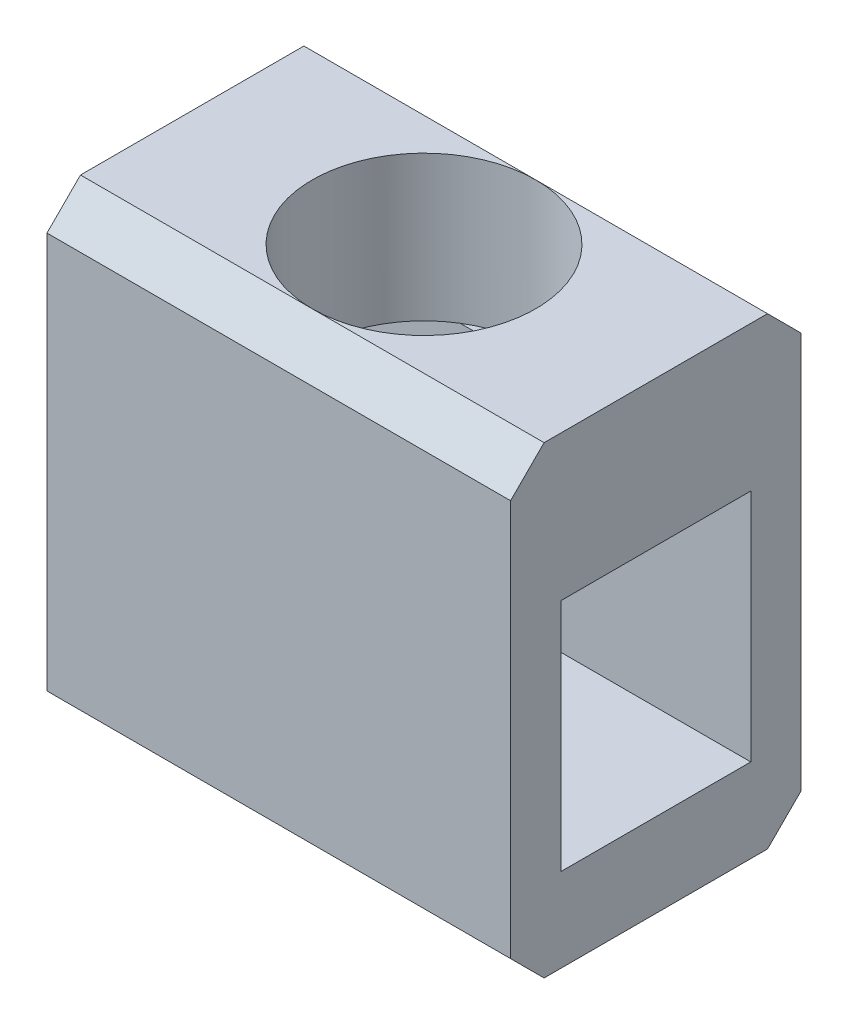
ISO-10303-21;
HEADER;
FILE_DESCRIPTION(('STEP AP214'),'2;1');
FILE_NAME('part.step','',(''),(''),'','','');
FILE_SCHEMA(('AUTOMOTIVE_DESIGN { 1 0 10303 214 1 1 1 1 }'));
ENDSEC;
DATA;
#1=APPLICATION_CONTEXT('core data for automotive mechanical design processes');
#2=APPLICATION_PROTOCOL_DEFINITION('international standard','automotive_design',2000,#1);
#3=PRODUCT_CONTEXT('',#1,'mechanical');
#4=PRODUCT('Part','Part','',(#3));
#5=PRODUCT_RELATED_PRODUCT_CATEGORY('part','',(#4));
#6=PRODUCT_DEFINITION_FORMATION('','',#4);
#7=PRODUCT_DEFINITION_CONTEXT('part definition',#1,'design');
#8=PRODUCT_DEFINITION('design','',#6,#7);
#9=PRODUCT_DEFINITION_SHAPE('','',#8);
#10=(LENGTH_UNIT() NAMED_UNIT(*) SI_UNIT(.MILLI.,.METRE.));
#11=(NAMED_UNIT(*) PLANE_ANGLE_UNIT() SI_UNIT($,.RADIAN.));
#12=(NAMED_UNIT(*) SI_UNIT($,.STERADIAN.) SOLID_ANGLE_UNIT());
#13=UNCERTAINTY_MEASURE_WITH_UNIT(LENGTH_MEASURE(1.E-05),#10,'distance_accuracy_value','');
#14=(GEOMETRIC_REPRESENTATION_CONTEXT(3) GLOBAL_UNCERTAINTY_ASSIGNED_CONTEXT((#13)) GLOBAL_UNIT_ASSIGNED_CONTEXT((#10,
#11,#12)) REPRESENTATION_CONTEXT('',''));
#15=CARTESIAN_POINT('',(0.,0.,0.));
#16=DIRECTION('',(0.,0.,1.));
#17=DIRECTION('',(1.,0.,0.));
#18=AXIS2_PLACEMENT_3D('',#15,#16,#17);
#19=CARTESIAN_POINT('',(12.992925392834,34.418991117245,-1.734184018515));
#20=DIRECTION('',(0.,-1.,0.));
#21=DIRECTION('',(0.,0.,-1.));
#22=AXIS2_PLACEMENT_3D('',#19,#20,#21);
#23=PLANE('',#22);
#24=DIRECTION('',(0.,0.,-1.));
#25=VECTOR('',#24,1.);
#26=CARTESIAN_POINT('',(10.917925392833,34.418991117245,-1.734184018515));
#27=LINE('',#26,#25);
#28=CARTESIAN_POINT('',(10.917925392833,34.418991117245,-0.03418401851468));
#29=VERTEX_POINT('',#28);
#30=CARTESIAN_POINT('',(10.917925392833,34.418991117245,-1.734184018515));
#31=VERTEX_POINT('',#30);
#32=EDGE_CURVE('E202',#29,#31,#27,.T.);
#33=ORIENTED_EDGE('',*,*,#32,.T.);
#34=DIRECTION('',(1.,0.,0.));
#35=VECTOR('',#34,1.);
#36=CARTESIAN_POINT('',(12.992925392834,34.418991117245,-1.734184018515));
#37=LINE('',#36,#35);
#38=CARTESIAN_POINT('',(12.4661427051912,34.418991117245,-1.734184018515));
#39=VERTEX_POINT('',#38);
#40=EDGE_CURVE('E199',#31,#39,#37,.T.);
#41=ORIENTED_EDGE('',*,*,#40,.T.);
#42=CARTESIAN_POINT('',(12.992925392834,34.418991117245,-0.884184018515));
#43=DIRECTION('',(0.,1.,0.));
#44=DIRECTION('',(0.,0.,1.));
#45=AXIS2_PLACEMENT_3D('',#42,#43,#44);
#46=CIRCLE('',#45,1.);
#47=CARTESIAN_POINT('',(12.4661427051914,34.418991117245,-0.03418401851468));
#48=VERTEX_POINT('',#47);
#49=EDGE_CURVE('E133',#39,#48,#46,.T.);
#50=ORIENTED_EDGE('',*,*,#49,.T.);
#51=DIRECTION('',(1.,0.,0.));
#52=VECTOR('',#51,1.);
#53=CARTESIAN_POINT('',(12.992925392834,34.418991117245,-0.0341840185146801));
#54=LINE('',#53,#52);
#55=EDGE_CURVE('E154',#48,#29,#54,.F.);
#56=ORIENTED_EDGE('',*,*,#55,.T.);
#57=EDGE_LOOP('',(#33,#41,#50,#56));
#58=FACE_BOUND('',#57,.T.);
#59=ADVANCED_FACE('F17',(#58),#23,.T.);
#60=CARTESIAN_POINT('',(12.992925392834,34.418991117245,-1.734184018515));
#61=DIRECTION('',(0.,-1.,0.));
#62=DIRECTION('',(0.,0.,-1.));
#63=AXIS2_PLACEMENT_3D('',#60,#61,#62);
#64=PLANE('',#63);
#65=DIRECTION('',(-1.,0.,0.));
#66=VECTOR('',#65,1.);
#67=CARTESIAN_POINT('',(12.992925392834,34.418991117245,-0.03418401851468));
#68=LINE('',#67,#66);
#69=CARTESIAN_POINT('',(13.5197080804761,34.418991117245,-0.03418401851468));
#70=VERTEX_POINT('',#69);
#71=EDGE_CURVE('E131',#48,#70,#68,.F.);
#72=ORIENTED_EDGE('',*,*,#71,.F.);
#73=CARTESIAN_POINT('',(12.992925392834,34.418991117245,-0.884184018515));
#74=DIRECTION('',(0.,1.,0.));
#75=DIRECTION('',(0.,0.,1.));
#76=AXIS2_PLACEMENT_3D('',#73,#74,#75);
#77=CIRCLE('',#76,1.);
#78=EDGE_CURVE('E128',#48,#70,#77,.T.);
#79=ORIENTED_EDGE('',*,*,#78,.T.);
#80=EDGE_LOOP('',(#72,#79));
#81=FACE_BOUND('',#80,.T.);
#82=ADVANCED_FACE('F129',(#81),#64,.F.);
#83=CARTESIAN_POINT('',(12.992925392834,34.418991117245,-1.734184018515));
#84=DIRECTION('',(0.,-1.,0.));
#85=DIRECTION('',(0.,0.,-1.));
#86=AXIS2_PLACEMENT_3D('',#83,#84,#85);
#87=PLANE('',#86);
#88=DIRECTION('',(1.,0.,0.));
#89=VECTOR('',#88,1.);
#90=CARTESIAN_POINT('',(12.992925392834,34.418991117245,-1.734184018515));
#91=LINE('',#90,#89);
#92=CARTESIAN_POINT('',(13.5197080804763,34.418991117245,-1.734184018515));
#93=VERTEX_POINT('',#92);
#94=EDGE_CURVE('E249',#93,#39,#91,.F.);
#95=ORIENTED_EDGE('',*,*,#94,.F.);
#96=CARTESIAN_POINT('',(12.992925392834,34.418991117245,-0.884184018515));
#97=DIRECTION('',(0.,1.,0.));
#98=DIRECTION('',(0.,0.,1.));
#99=AXIS2_PLACEMENT_3D('',#96,#97,#98);
#100=CIRCLE('',#99,1.);
#101=EDGE_CURVE('E122',#93,#39,#100,.T.);
#102=ORIENTED_EDGE('',*,*,#101,.T.);
#103=EDGE_LOOP('',(#95,#102));
#104=FACE_BOUND('',#103,.T.);
#105=ADVANCED_FACE('F487',(#104),#87,.F.);
#106=CARTESIAN_POINT('',(12.992925392834,32.318991117245,-0.03418401851468));
#107=DIRECTION('',(0.,1.,0.));
#108=DIRECTION('',(0.,0.,1.));
#109=AXIS2_PLACEMENT_3D('',#106,#107,#108);
#110=PLANE('',#109);
#111=DIRECTION('',(-1.,0.,0.));
#112=VECTOR('',#111,1.);
#113=CARTESIAN_POINT('',(12.992925392834,32.318991117245,-0.03418401851468));
#114=LINE('',#113,#112);
#115=CARTESIAN_POINT('',(15.067925392834,32.318991117245,-0.03418401851468));
#116=VERTEX_POINT('',#115);
#117=CARTESIAN_POINT('',(10.917925392833,32.318991117245,-0.03418401851468));
#118=VERTEX_POINT('',#117);
#119=EDGE_CURVE('E149',#116,#118,#114,.T.);
#120=ORIENTED_EDGE('',*,*,#119,.F.);
#121=DIRECTION('',(0.,0.,1.));
#122=VECTOR('',#121,1.);
#123=CARTESIAN_POINT('',(15.067925392834,32.318991117245,-0.03418401851468));
#124=LINE('',#123,#122);
#125=CARTESIAN_POINT('',(15.067925392834,32.318991117245,-1.734184018515));
#126=VERTEX_POINT('',#125);
#127=EDGE_CURVE('E142',#116,#126,#124,.F.);
#128=ORIENTED_EDGE('',*,*,#127,.T.);
#129=DIRECTION('',(1.,0.,0.));
#130=VECTOR('',#129,1.);
#131=CARTESIAN_POINT('',(12.992925392834,32.318991117245,-1.734184018515));
#132=LINE('',#131,#130);
#133=CARTESIAN_POINT('',(10.917925392833,32.318991117245,-1.734184018515));
#134=VERTEX_POINT('',#133);
#135=EDGE_CURVE('E245',#134,#126,#132,.T.);
#136=ORIENTED_EDGE('',*,*,#135,.F.);
#137=DIRECTION('',(0.,0.,1.));
#138=VECTOR('',#137,1.);
#139=CARTESIAN_POINT('',(10.917925392833,32.318991117245,-0.03418401851468));
#140=LINE('',#139,#138);
#141=EDGE_CURVE('E162',#134,#118,#140,.T.);
#142=ORIENTED_EDGE('',*,*,#141,.T.);
#143=EDGE_LOOP('',(#120,#128,#136,#142));
#144=FACE_BOUND('',#143,.T.);
#145=ADVANCED_FACE('F244',(#144),#110,.T.);
#146=CARTESIAN_POINT('',(12.992925392834,34.418991117245,-1.734184018515));
#147=DIRECTION('',(0.,-1.,0.));
#148=DIRECTION('',(0.,0.,-1.));
#149=AXIS2_PLACEMENT_3D('',#146,#147,#148);
#150=PLANE('',#149);
#151=DIRECTION('',(0.,0.,-1.));
#152=VECTOR('',#151,1.);
#153=CARTESIAN_POINT('',(15.067925392834,34.418991117245,-1.734184018515));
#154=LINE('',#153,#152);
#155=CARTESIAN_POINT('',(15.067925392834,34.418991117245,-1.734184018515));
#156=VERTEX_POINT('',#155);
#157=CARTESIAN_POINT('',(15.067925392834,34.418991117245,-0.03418401851468));
#158=VERTEX_POINT('',#157);
#159=EDGE_CURVE('E141',#156,#158,#154,.F.);
#160=ORIENTED_EDGE('',*,*,#159,.T.);
#161=DIRECTION('',(-1.,0.,0.));
#162=VECTOR('',#161,1.);
#163=CARTESIAN_POINT('',(12.992925392834,34.418991117245,-0.03418401851468));
#164=LINE('',#163,#162);
#165=EDGE_CURVE('E144',#70,#158,#164,.F.);
#166=ORIENTED_EDGE('',*,*,#165,.F.);
#167=CARTESIAN_POINT('',(12.992925392834,34.418991117245,-0.884184018515));
#168=DIRECTION('',(0.,1.,0.));
#169=DIRECTION('',(0.,0.,1.));
#170=AXIS2_PLACEMENT_3D('',#167,#168,#169);
#171=CIRCLE('',#170,1.);
#172=EDGE_CURVE('E20',#70,#93,#171,.T.);
#173=ORIENTED_EDGE('',*,*,#172,.T.);
#174=DIRECTION('',(1.,0.,0.));
#175=VECTOR('',#174,1.);
#176=CARTESIAN_POINT('',(12.992925392834,34.418991117245,-1.734184018515));
#177=LINE('',#176,#175);
#178=EDGE_CURVE('E225',#156,#93,#177,.F.);
#179=ORIENTED_EDGE('',*,*,#178,.F.);
#180=EDGE_LOOP('',(#160,#166,#173,#179));
#181=FACE_BOUND('',#180,.T.);
#182=ADVANCED_FACE('F145',(#181),#150,.T.);
#183=CARTESIAN_POINT('',(12.992925392834,34.466448576029,-0.884184018515));
#184=DIRECTION('',(0.,1.,0.));
#185=DIRECTION('',(0.,0.,1.));
#186=AXIS2_PLACEMENT_3D('',#183,#184,#185);
#187=CYLINDRICAL_SURFACE('',#186,1.);
#188=CARTESIAN_POINT('',(12.992925392834,35.718991117245,-0.884184018515));
#189=DIRECTION('',(0.,1.,0.));
#190=DIRECTION('',(0.,0.,1.));
#191=AXIS2_PLACEMENT_3D('',#188,#189,#190);
#192=CIRCLE('',#191,1.);
#193=CARTESIAN_POINT('',(12.992925392834,35.718991117245,0.115815981485));
#194=VERTEX_POINT('',#193);
#195=CARTESIAN_POINT('',(12.992925392834,35.718991117245,-1.884184018515));
#196=VERTEX_POINT('',#195);
#197=EDGE_CURVE('E223',#194,#196,#192,.F.);
#198=ORIENTED_EDGE('',*,*,#197,.F.);
#199=CARTESIAN_POINT('',(12.992925392834,35.718991117245,-0.884184018515));
#200=DIRECTION('',(0.,1.,0.));
#201=DIRECTION('',(0.,0.,1.));
#202=AXIS2_PLACEMENT_3D('',#199,#200,#201);
#203=CIRCLE('',#202,1.);
#204=EDGE_CURVE('E156',#196,#194,#203,.F.);
#205=ORIENTED_EDGE('',*,*,#204,.F.);
#206=EDGE_LOOP('',(#198,#205));
#207=FACE_BOUND('',#206,.T.);
#208=ORIENTED_EDGE('',*,*,#172,.F.);
#209=ORIENTED_EDGE('',*,*,#78,.F.);
#210=ORIENTED_EDGE('',*,*,#49,.F.);
#211=ORIENTED_EDGE('',*,*,#101,.F.);
#212=EDGE_LOOP('',(#208,#209,#210,#211));
#213=FACE_BOUND('',#212,.T.);
#214=ADVANCED_FACE('F137',(#207,#213),#187,.F.);
#215=CARTESIAN_POINT('',(12.992925392834,35.568991117245,0.265815981485));
#216=DIRECTION('',(0.,0.707106781186548,0.707106781186548));
#217=DIRECTION('',(0.,-0.707106781186548,0.707106781186548));
#218=AXIS2_PLACEMENT_3D('',#215,#216,#217);
#219=PLANE('',#218);
#220=DIRECTION('',(1.,0.,0.));
#221=VECTOR('',#220,1.);
#222=CARTESIAN_POINT('',(12.992925392834,35.418991117245,0.415815981485));
#223=LINE('',#222,#221);
#224=CARTESIAN_POINT('',(15.067925392834,35.418991117245,0.415815981484998));
#225=VERTEX_POINT('',#224);
#226=CARTESIAN_POINT('',(10.917925392833,35.418991117245,0.415815981484999));
#227=VERTEX_POINT('',#226);
#228=EDGE_CURVE('E178',#225,#227,#223,.F.);
#229=ORIENTED_EDGE('',*,*,#228,.F.);
#230=DIRECTION('',(0.,-0.707106781186548,0.707106781186548));
#231=VECTOR('',#230,1.);
#232=CARTESIAN_POINT('',(15.067925392834,35.568991117245,0.265815981485));
#233=LINE('',#232,#231);
#234=CARTESIAN_POINT('',(15.067925392834,35.718991117245,0.115815981485));
#235=VERTEX_POINT('',#234);
#236=EDGE_CURVE('E173',#225,#235,#233,.F.);
#237=ORIENTED_EDGE('',*,*,#236,.T.);
#238=DIRECTION('',(1.,0.,0.));
#239=VECTOR('',#238,1.);
#240=CARTESIAN_POINT('',(12.992925392834,35.718991117245,0.115815981485));
#241=LINE('',#240,#239);
#242=EDGE_CURVE('E159',#194,#235,#241,.T.);
#243=ORIENTED_EDGE('',*,*,#242,.F.);
#244=DIRECTION('',(1.,0.,0.));
#245=VECTOR('',#244,1.);
#246=CARTESIAN_POINT('',(12.992925392834,35.718991117245,0.115815981485));
#247=LINE('',#246,#245);
#248=CARTESIAN_POINT('',(10.917925392833,35.718991117245,0.115815981485));
#249=VERTEX_POINT('',#248);
#250=EDGE_CURVE('E182',#249,#194,#247,.T.);
#251=ORIENTED_EDGE('',*,*,#250,.F.);
#252=DIRECTION('',(0.,-0.707106781186548,0.707106781186548));
#253=VECTOR('',#252,1.);
#254=CARTESIAN_POINT('',(10.917925392833,35.568991117245,0.265815981485));
#255=LINE('',#254,#253);
#256=EDGE_CURVE('E132',#249,#227,#255,.T.);
#257=ORIENTED_EDGE('',*,*,#256,.T.);
#258=EDGE_LOOP('',(#229,#237,#243,#251,#257));
#259=FACE_BOUND('',#258,.T.);
#260=ADVANCED_FACE('F344',(#259),#219,.T.);
#261=CARTESIAN_POINT('',(12.992925392834,31.718991117245,0.265815981485));
#262=DIRECTION('',(0.,-0.707106781186548,0.707106781186548));
#263=DIRECTION('',(0.,-0.707106781186548,-0.707106781186548));
#264=AXIS2_PLACEMENT_3D('',#261,#262,#263);
#265=PLANE('',#264);
#266=DIRECTION('',(1.,0.,0.));
#267=VECTOR('',#266,1.);
#268=CARTESIAN_POINT('',(12.992925392834,31.868991117245,0.415815981485));
#269=LINE('',#268,#267);
#270=CARTESIAN_POINT('',(10.917925392833,31.868991117245,0.415815981484999));
#271=VERTEX_POINT('',#270);
#272=CARTESIAN_POINT('',(15.067925392834,31.868991117245,0.415815981484999));
#273=VERTEX_POINT('',#272);
#274=EDGE_CURVE('E181',#271,#273,#269,.T.);
#275=ORIENTED_EDGE('',*,*,#274,.F.);
#276=DIRECTION('',(0.,-0.707106781186548,-0.707106781186548));
#277=VECTOR('',#276,1.);
#278=CARTESIAN_POINT('',(10.917925392833,31.718991117245,0.265815981485));
#279=LINE('',#278,#277);
#280=CARTESIAN_POINT('',(10.917925392833,31.568991117245,0.115815981485001));
#281=VERTEX_POINT('',#280);
#282=EDGE_CURVE('E263',#271,#281,#279,.T.);
#283=ORIENTED_EDGE('',*,*,#282,.T.);
#284=DIRECTION('',(1.,0.,0.));
#285=VECTOR('',#284,1.);
#286=CARTESIAN_POINT('',(12.992925392834,31.568991117245,0.115815981485));
#287=LINE('',#286,#285);
#288=CARTESIAN_POINT('',(15.067925392834,31.568991117245,0.115815981485001));
#289=VERTEX_POINT('',#288);
#290=EDGE_CURVE('E292',#289,#281,#287,.F.);
#291=ORIENTED_EDGE('',*,*,#290,.F.);
#292=DIRECTION('',(0.,-0.707106781186548,-0.707106781186548));
#293=VECTOR('',#292,1.);
#294=CARTESIAN_POINT('',(15.067925392834,31.718991117245,0.265815981485));
#295=LINE('',#294,#293);
#296=EDGE_CURVE('E175',#289,#273,#295,.F.);
#297=ORIENTED_EDGE('',*,*,#296,.T.);
#298=EDGE_LOOP('',(#275,#283,#291,#297));
#299=FACE_BOUND('',#298,.T.);
#300=ADVANCED_FACE('F356',(#299),#265,.T.);
#301=CARTESIAN_POINT('',(12.992925392834,35.718991117245,-2.184184018515));
#302=DIRECTION('',(0.,1.,0.));
#303=DIRECTION('',(0.,0.,1.));
#304=AXIS2_PLACEMENT_3D('',#301,#302,#303);
#305=PLANE('',#304);
#306=DIRECTION('',(1.,0.,0.));
#307=VECTOR('',#306,1.);
#308=CARTESIAN_POINT('',(12.992925392834,35.718991117245,-1.884184018515));
#309=LINE('',#308,#307);
#310=CARTESIAN_POINT('',(15.067925392834,35.718991117245,-1.884184018515));
#311=VERTEX_POINT('',#310);
#312=EDGE_CURVE('E170',#196,#311,#309,.T.);
#313=ORIENTED_EDGE('',*,*,#312,.F.);
#314=ORIENTED_EDGE('',*,*,#204,.T.);
#315=ORIENTED_EDGE('',*,*,#242,.T.);
#316=DIRECTION('',(0.,0.,-1.));
#317=VECTOR('',#316,1.);
#318=CARTESIAN_POINT('',(15.067925392834,35.718991117245,-0.884184018515));
#319=LINE('',#318,#317);
#320=EDGE_CURVE('E189',#311,#235,#319,.F.);
#321=ORIENTED_EDGE('',*,*,#320,.F.);
#322=EDGE_LOOP('',(#313,#314,#315,#321));
#323=FACE_BOUND('',#322,.T.);
#324=ADVANCED_FACE('F341',(#323),#305,.T.);
#325=CARTESIAN_POINT('',(12.992925392834,34.418991117245,-0.03418401851468));
#326=DIRECTION('',(0.,0.,-1.));
#327=DIRECTION('',(-1.,0.,0.));
#328=AXIS2_PLACEMENT_3D('',#325,#326,#327);
#329=PLANE('',#328);
#330=DIRECTION('',(0.,1.,0.));
#331=VECTOR('',#330,1.);
#332=CARTESIAN_POINT('',(10.917925392833,38.718991117245,-0.03418401851468));
#333=LINE('',#332,#331);
#334=EDGE_CURVE('E212',#118,#29,#333,.T.);
#335=ORIENTED_EDGE('',*,*,#334,.T.);
#336=ORIENTED_EDGE('',*,*,#55,.F.);
#337=ORIENTED_EDGE('',*,*,#71,.T.);
#338=ORIENTED_EDGE('',*,*,#165,.T.);
#339=DIRECTION('',(0.,1.,0.));
#340=VECTOR('',#339,1.);
#341=CARTESIAN_POINT('',(15.067925392834,38.718991117245,-0.03418401851468));
#342=LINE('',#341,#340);
#343=EDGE_CURVE('E167',#116,#158,#342,.T.);
#344=ORIENTED_EDGE('',*,*,#343,.F.);
#345=ORIENTED_EDGE('',*,*,#119,.T.);
#346=EDGE_LOOP('',(#335,#336,#337,#338,#344,#345));
#347=FACE_BOUND('',#346,.T.);
#348=ADVANCED_FACE('F152',(#347),#329,.T.);
#349=CARTESIAN_POINT('',(12.992925392834,34.418991117245,-1.734184018515));
#350=DIRECTION('',(0.,0.,1.));
#351=DIRECTION('',(1.,0.,0.));
#352=AXIS2_PLACEMENT_3D('',#349,#350,#351);
#353=PLANE('',#352);
#354=DIRECTION('',(0.,1.,0.));
#355=VECTOR('',#354,1.);
#356=CARTESIAN_POINT('',(15.067925392834,38.718991117245,-1.734184018515));
#357=LINE('',#356,#355);
#358=EDGE_CURVE('E169',#156,#126,#357,.F.);
#359=ORIENTED_EDGE('',*,*,#358,.F.);
#360=ORIENTED_EDGE('',*,*,#178,.T.);
#361=ORIENTED_EDGE('',*,*,#94,.T.);
#362=ORIENTED_EDGE('',*,*,#40,.F.);
#363=DIRECTION('',(0.,1.,0.));
#364=VECTOR('',#363,1.);
#365=CARTESIAN_POINT('',(10.917925392833,38.718991117245,-1.734184018515));
#366=LINE('',#365,#364);
#367=EDGE_CURVE('E208',#31,#134,#366,.F.);
#368=ORIENTED_EDGE('',*,*,#367,.T.);
#369=ORIENTED_EDGE('',*,*,#135,.T.);
#370=EDGE_LOOP('',(#359,#360,#361,#362,#368,#369));
#371=FACE_BOUND('',#370,.T.);
#372=ADVANCED_FACE('F255',(#371),#353,.T.);
#373=CARTESIAN_POINT('',(12.992925392834,35.718991117245,-2.184184018515));
#374=DIRECTION('',(0.,1.,0.));
#375=DIRECTION('',(0.,0.,1.));
#376=AXIS2_PLACEMENT_3D('',#373,#374,#375);
#377=PLANE('',#376);
#378=DIRECTION('',(0.,0.,-1.));
#379=VECTOR('',#378,1.);
#380=CARTESIAN_POINT('',(10.917925392833,35.718991117245,-0.884184018515));
#381=LINE('',#380,#379);
#382=CARTESIAN_POINT('',(10.917925392833,35.718991117245,-1.884184018515));
#383=VERTEX_POINT('',#382);
#384=EDGE_CURVE('E196',#383,#249,#381,.F.);
#385=ORIENTED_EDGE('',*,*,#384,.T.);
#386=ORIENTED_EDGE('',*,*,#250,.T.);
#387=ORIENTED_EDGE('',*,*,#197,.T.);
#388=DIRECTION('',(1.,0.,0.));
#389=VECTOR('',#388,1.);
#390=CARTESIAN_POINT('',(12.992925392834,35.718991117245,-1.884184018515));
#391=LINE('',#390,#389);
#392=EDGE_CURVE('E287',#383,#196,#391,.T.);
#393=ORIENTED_EDGE('',*,*,#392,.F.);
#394=EDGE_LOOP('',(#385,#386,#387,#393));
#395=FACE_BOUND('',#394,.T.);
#396=ADVANCED_FACE('F347',(#395),#377,.T.);
#397=CARTESIAN_POINT('',(12.992925392834,35.718991117245,0.415815981485));
#398=DIRECTION('',(0.,0.,1.));
#399=DIRECTION('',(1.,0.,0.));
#400=AXIS2_PLACEMENT_3D('',#397,#398,#399);
#401=PLANE('',#400);
#402=ORIENTED_EDGE('',*,*,#274,.T.);
#403=DIRECTION('',(0.,1.,0.));
#404=VECTOR('',#403,1.);
#405=CARTESIAN_POINT('',(15.067925392834,38.718991117245,0.415815981485));
#406=LINE('',#405,#404);
#407=EDGE_CURVE('E185',#225,#273,#406,.F.);
#408=ORIENTED_EDGE('',*,*,#407,.F.);
#409=ORIENTED_EDGE('',*,*,#228,.T.);
#410=DIRECTION('',(0.,1.,0.));
#411=VECTOR('',#410,1.);
#412=CARTESIAN_POINT('',(10.917925392833,38.718991117245,0.415815981485));
#413=LINE('',#412,#411);
#414=EDGE_CURVE('E192',#227,#271,#413,.F.);
#415=ORIENTED_EDGE('',*,*,#414,.T.);
#416=EDGE_LOOP('',(#402,#408,#409,#415));
#417=FACE_BOUND('',#416,.T.);
#418=ADVANCED_FACE('F374',(#417),#401,.T.);
#419=CARTESIAN_POINT('',(12.992925392834,31.568991117245,-2.184184018515));
#420=DIRECTION('',(0.,-1.,0.));
#421=DIRECTION('',(0.,0.,-1.));
#422=AXIS2_PLACEMENT_3D('',#419,#420,#421);
#423=PLANE('',#422);
#424=ORIENTED_EDGE('',*,*,#290,.T.);
#425=DIRECTION('',(0.,0.,-1.));
#426=VECTOR('',#425,1.);
#427=CARTESIAN_POINT('',(10.917925392833,31.568991117245,-0.884184018515));
#428=LINE('',#427,#426);
#429=CARTESIAN_POINT('',(10.917925392833,31.568991117245,-1.884184018515));
#430=VERTEX_POINT('',#429);
#431=EDGE_CURVE('E195',#281,#430,#428,.T.);
#432=ORIENTED_EDGE('',*,*,#431,.T.);
#433=DIRECTION('',(1.,0.,0.));
#434=VECTOR('',#433,1.);
#435=CARTESIAN_POINT('',(12.992925392834,31.568991117245,-1.884184018515));
#436=LINE('',#435,#434);
#437=CARTESIAN_POINT('',(15.067925392834,31.568991117245,-1.884184018515));
#438=VERTEX_POINT('',#437);
#439=EDGE_CURVE('E278',#438,#430,#436,.F.);
#440=ORIENTED_EDGE('',*,*,#439,.F.);
#441=DIRECTION('',(0.,0.,-1.));
#442=VECTOR('',#441,1.);
#443=CARTESIAN_POINT('',(15.067925392834,31.568991117245,-0.884184018515));
#444=LINE('',#443,#442);
#445=EDGE_CURVE('E188',#289,#438,#444,.T.);
#446=ORIENTED_EDGE('',*,*,#445,.F.);
#447=EDGE_LOOP('',(#424,#432,#440,#446));
#448=FACE_BOUND('',#447,.T.);
#449=ADVANCED_FACE('F329',(#448),#423,.T.);
#450=CARTESIAN_POINT('',(12.992925392834,35.568991117245,-2.034184018515));
#451=DIRECTION('',(0.,0.707106781186548,-0.707106781186548));
#452=DIRECTION('',(0.,0.707106781186548,0.707106781186548));
#453=AXIS2_PLACEMENT_3D('',#450,#451,#452);
#454=PLANE('',#453);
#455=DIRECTION('',(-1.,0.,0.));
#456=VECTOR('',#455,1.);
#457=CARTESIAN_POINT('',(12.992925392834,35.418991117245,-2.184184018515));
#458=LINE('',#457,#456);
#459=CARTESIAN_POINT('',(10.917925392833,35.418991117245,-2.184184018515));
#460=VERTEX_POINT('',#459);
#461=CARTESIAN_POINT('',(15.067925392834,35.418991117245,-2.184184018515));
#462=VERTEX_POINT('',#461);
#463=EDGE_CURVE('E312',#460,#462,#458,.F.);
#464=ORIENTED_EDGE('',*,*,#463,.F.);
#465=DIRECTION('',(0.,0.707106781186542,0.707106781186553));
#466=VECTOR('',#465,1.);
#467=CARTESIAN_POINT('',(10.917925392833,35.418991117245,-2.184184018515));
#468=LINE('',#467,#466);
#469=EDGE_CURVE('E211',#460,#383,#468,.T.);
#470=ORIENTED_EDGE('',*,*,#469,.T.);
#471=ORIENTED_EDGE('',*,*,#392,.T.);
#472=ORIENTED_EDGE('',*,*,#312,.T.);
#473=DIRECTION('',(0.,0.707106781186542,0.707106781186553));
#474=VECTOR('',#473,1.);
#475=CARTESIAN_POINT('',(15.067925392834,35.418991117245,-2.184184018515));
#476=LINE('',#475,#474);
#477=EDGE_CURVE('E275',#462,#311,#476,.T.);
#478=ORIENTED_EDGE('',*,*,#477,.F.);
#479=EDGE_LOOP('',(#464,#470,#471,#472,#478));
#480=FACE_BOUND('',#479,.T.);
#481=ADVANCED_FACE('F337',(#480),#454,.T.);
#482=CARTESIAN_POINT('',(15.067925392834,38.718991117245,-0.884184018515));
#483=DIRECTION('',(1.,0.,0.));
#484=DIRECTION('',(0.,0.,-1.));
#485=AXIS2_PLACEMENT_3D('',#482,#483,#484);
#486=PLANE('',#485);
#487=DIRECTION('',(0.,1.,0.));
#488=VECTOR('',#487,1.);
#489=CARTESIAN_POINT('',(15.067925392834,35.718991117245,-2.184184018515));
#490=LINE('',#489,#488);
#491=CARTESIAN_POINT('',(15.067925392834,31.868991117245,-2.184184018515));
#492=VERTEX_POINT('',#491);
#493=EDGE_CURVE('E315',#462,#492,#490,.F.);
#494=ORIENTED_EDGE('',*,*,#493,.F.);
#495=ORIENTED_EDGE('',*,*,#477,.T.);
#496=ORIENTED_EDGE('',*,*,#320,.T.);
#497=ORIENTED_EDGE('',*,*,#236,.F.);
#498=ORIENTED_EDGE('',*,*,#407,.T.);
#499=ORIENTED_EDGE('',*,*,#296,.F.);
#500=ORIENTED_EDGE('',*,*,#445,.T.);
#501=DIRECTION('',(0.,0.707106781186548,-0.707106781186548));
#502=VECTOR('',#501,1.);
#503=CARTESIAN_POINT('',(15.067925392834,31.718991117245,-2.034184018515));
#504=LINE('',#503,#502);
#505=EDGE_CURVE('E220',#492,#438,#504,.F.);
#506=ORIENTED_EDGE('',*,*,#505,.F.);
#507=EDGE_LOOP('',(#494,#495,#496,#497,#498,#499,#500,#506));
#508=FACE_BOUND('',#507,.T.);
#509=ORIENTED_EDGE('',*,*,#358,.T.);
#510=ORIENTED_EDGE('',*,*,#127,.F.);
#511=ORIENTED_EDGE('',*,*,#343,.T.);
#512=ORIENTED_EDGE('',*,*,#159,.F.);
#513=EDGE_LOOP('',(#509,#510,#511,#512));
#514=FACE_BOUND('',#513,.T.);
#515=ADVANCED_FACE('F324',(#508,#514),#486,.T.);
#516=CARTESIAN_POINT('',(12.992925392834,31.718991117245,-2.034184018515));
#517=DIRECTION('',(0.,-0.707106781186548,-0.707106781186548));
#518=DIRECTION('',(0.,0.707106781186548,-0.707106781186548));
#519=AXIS2_PLACEMENT_3D('',#516,#517,#518);
#520=PLANE('',#519);
#521=DIRECTION('',(-1.,0.,0.));
#522=VECTOR('',#521,1.);
#523=CARTESIAN_POINT('',(12.992925392834,31.868991117245,-2.184184018515));
#524=LINE('',#523,#522);
#525=CARTESIAN_POINT('',(10.917925392833,31.868991117245,-2.184184018515));
#526=VERTEX_POINT('',#525);
#527=EDGE_CURVE('E26',#492,#526,#524,.T.);
#528=ORIENTED_EDGE('',*,*,#527,.F.);
#529=ORIENTED_EDGE('',*,*,#505,.T.);
#530=ORIENTED_EDGE('',*,*,#439,.T.);
#531=DIRECTION('',(0.,0.707106781186542,-0.707106781186553));
#532=VECTOR('',#531,1.);
#533=CARTESIAN_POINT('',(10.917925392833,31.568991117245,-1.884184018515));
#534=LINE('',#533,#532);
#535=EDGE_CURVE('E35',#430,#526,#534,.T.);
#536=ORIENTED_EDGE('',*,*,#535,.T.);
#537=EDGE_LOOP('',(#528,#529,#530,#536));
#538=FACE_BOUND('',#537,.T.);
#539=ADVANCED_FACE('F322',(#538),#520,.T.);
#540=CARTESIAN_POINT('',(10.917925392833,38.718991117245,-0.884184018515));
#541=DIRECTION('',(1.,0.,0.));
#542=DIRECTION('',(0.,0.,-1.));
#543=AXIS2_PLACEMENT_3D('',#540,#541,#542);
#544=PLANE('',#543);
#545=ORIENTED_EDGE('',*,*,#535,.F.);
#546=ORIENTED_EDGE('',*,*,#431,.F.);
#547=ORIENTED_EDGE('',*,*,#282,.F.);
#548=ORIENTED_EDGE('',*,*,#414,.F.);
#549=ORIENTED_EDGE('',*,*,#256,.F.);
#550=ORIENTED_EDGE('',*,*,#384,.F.);
#551=ORIENTED_EDGE('',*,*,#469,.F.);
#552=DIRECTION('',(0.,1.,0.));
#553=VECTOR('',#552,1.);
#554=CARTESIAN_POINT('',(10.917925392833,35.718991117245,-2.184184018515));
#555=LINE('',#554,#553);
#556=EDGE_CURVE('E11',#526,#460,#555,.T.);
#557=ORIENTED_EDGE('',*,*,#556,.F.);
#558=EDGE_LOOP('',(#545,#546,#547,#548,#549,#550,#551,#557));
#559=FACE_BOUND('',#558,.T.);
#560=ORIENTED_EDGE('',*,*,#367,.F.);
#561=ORIENTED_EDGE('',*,*,#32,.F.);
#562=ORIENTED_EDGE('',*,*,#334,.F.);
#563=ORIENTED_EDGE('',*,*,#141,.F.);
#564=EDGE_LOOP('',(#560,#561,#562,#563));
#565=FACE_BOUND('',#564,.T.);
#566=ADVANCED_FACE('F251',(#559,#565),#544,.F.);
#567=CARTESIAN_POINT('',(12.992925392834,35.718991117245,-2.184184018515));
#568=DIRECTION('',(0.,0.,-1.));
#569=DIRECTION('',(-1.,0.,0.));
#570=AXIS2_PLACEMENT_3D('',#567,#568,#569);
#571=PLANE('',#570);
#572=ORIENTED_EDGE('',*,*,#527,.T.);
#573=ORIENTED_EDGE('',*,*,#556,.T.);
#574=ORIENTED_EDGE('',*,*,#463,.T.);
#575=ORIENTED_EDGE('',*,*,#493,.T.);
#576=EDGE_LOOP('',(#572,#573,#574,#575));
#577=FACE_BOUND('',#576,.T.);
#578=ADVANCED_FACE('F320',(#577),#571,.T.);
#579=CLOSED_SHELL('',(#59,#82,#105,#145,#182,#214,#260,#300,#324,#348,#372,#396,#418,#449,#481,
#515,#539,#566,#578));
#580=MANIFOLD_SOLID_BREP('B1',#579);
#581=ADVANCED_BREP_SHAPE_REPRESENTATION('',(#18,#580),#14);
#582=SHAPE_DEFINITION_REPRESENTATION(#9,#581);
ENDSEC;
END-ISO-10303-21;
